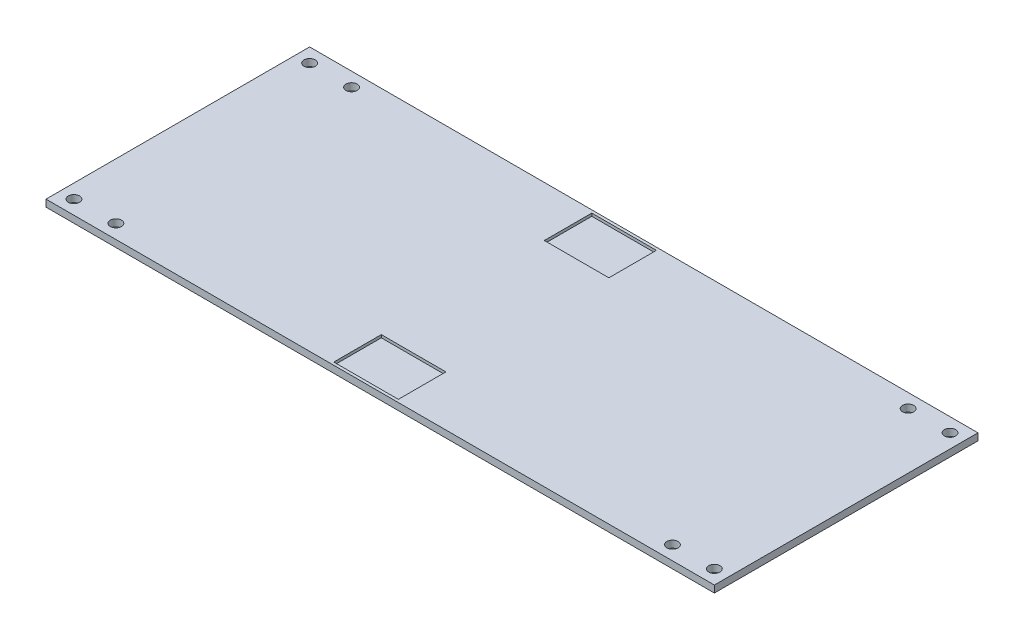
ISO-10303-21;
HEADER;
FILE_DESCRIPTION(('STEP AP214'),'2;1');
FILE_NAME('part.step','',(''),(''),'','','');
FILE_SCHEMA(('AUTOMOTIVE_DESIGN { 1 0 10303 214 1 1 1 1 }'));
ENDSEC;
DATA;
#1=APPLICATION_CONTEXT('core data for automotive mechanical design processes');
#2=APPLICATION_PROTOCOL_DEFINITION('international standard','automotive_design',2000,#1);
#3=PRODUCT_CONTEXT('',#1,'mechanical');
#4=PRODUCT('Part','Part','',(#3));
#5=PRODUCT_RELATED_PRODUCT_CATEGORY('part','',(#4));
#6=PRODUCT_DEFINITION_FORMATION('','',#4);
#7=PRODUCT_DEFINITION_CONTEXT('part definition',#1,'design');
#8=PRODUCT_DEFINITION('design','',#6,#7);
#9=PRODUCT_DEFINITION_SHAPE('','',#8);
#10=(LENGTH_UNIT() NAMED_UNIT(*) SI_UNIT(.MILLI.,.METRE.));
#11=(NAMED_UNIT(*) PLANE_ANGLE_UNIT() SI_UNIT($,.RADIAN.));
#12=(NAMED_UNIT(*) SI_UNIT($,.STERADIAN.) SOLID_ANGLE_UNIT());
#13=UNCERTAINTY_MEASURE_WITH_UNIT(LENGTH_MEASURE(1.E-05),#10,'distance_accuracy_value','');
#14=(GEOMETRIC_REPRESENTATION_CONTEXT(3) GLOBAL_UNCERTAINTY_ASSIGNED_CONTEXT((#13)) GLOBAL_UNIT_ASSIGNED_CONTEXT((#10,
#11,#12)) REPRESENTATION_CONTEXT('',''));
#15=CARTESIAN_POINT('',(0.,0.,0.));
#16=DIRECTION('',(0.,0.,1.));
#17=DIRECTION('',(1.,0.,0.));
#18=AXIS2_PLACEMENT_3D('',#15,#16,#17);
#19=CARTESIAN_POINT('',(0.,5.,0.));
#20=DIRECTION('',(0.,1.,0.));
#21=DIRECTION('',(0.,0.,1.));
#22=AXIS2_PLACEMENT_3D('',#19,#20,#21);
#23=PLANE('',#22);
#24=CARTESIAN_POINT('',(-62.9175454838879,5.,-131.382140187336));
#25=DIRECTION('',(0.,1.,0.));
#26=DIRECTION('',(0.,0.,1.));
#27=AXIS2_PLACEMENT_3D('',#24,#25,#26);
#28=CIRCLE('',#27,4.00000000000001);
#29=CARTESIAN_POINT('',(-62.9175454838879,5.,-127.382140187336));
#30=VERTEX_POINT('',#29);
#31=EDGE_CURVE('E190',#30,#30,#28,.T.);
#32=ORIENTED_EDGE('',*,*,#31,.F.);
#33=EDGE_LOOP('',(#32));
#34=FACE_BOUND('',#33,.T.);
#35=CARTESIAN_POINT('',(395.236140527522,5.,-131.382140187336));
#36=DIRECTION('',(0.,1.,0.));
#37=DIRECTION('',(0.,0.,1.));
#38=AXIS2_PLACEMENT_3D('',#35,#36,#37);
#39=CIRCLE('',#38,3.99999999999999);
#40=CARTESIAN_POINT('',(395.236140527522,5.,-127.382140187336));
#41=VERTEX_POINT('',#40);
#42=EDGE_CURVE('E193',#41,#41,#39,.T.);
#43=ORIENTED_EDGE('',*,*,#42,.F.);
#44=EDGE_LOOP('',(#43));
#45=FACE_BOUND('',#44,.T.);
#46=DIRECTION('',(1.,0.,0.));
#47=VECTOR('',#46,1.);
#48=CARTESIAN_POINT('',(0.,5.,-141.382140187336));
#49=LINE('',#48,#47);
#50=CARTESIAN_POINT('',(-72.917545483888,5.,-141.382140187336));
#51=VERTEX_POINT('',#50);
#52=CARTESIAN_POINT('',(405.236140527522,5.,-141.382140187336));
#53=VERTEX_POINT('',#52);
#54=EDGE_CURVE('E197',#51,#53,#49,.T.);
#55=ORIENTED_EDGE('',*,*,#54,.F.);
#56=DIRECTION('',(0.,0.,1.));
#57=VECTOR('',#56,1.);
#58=CARTESIAN_POINT('',(-72.9175454838879,5.,0.));
#59=LINE('',#58,#57);
#60=CARTESIAN_POINT('',(-72.9175454838879,5.,47.2115683659722));
#61=VERTEX_POINT('',#60);
#62=EDGE_CURVE('E200',#51,#61,#59,.T.);
#63=ORIENTED_EDGE('',*,*,#62,.T.);
#64=DIRECTION('',(1.,0.,0.));
#65=VECTOR('',#64,1.);
#66=CARTESIAN_POINT('',(0.,5.,47.2115683659722));
#67=LINE('',#66,#65);
#68=CARTESIAN_POINT('',(405.236140527522,5.,47.2115683659721));
#69=VERTEX_POINT('',#68);
#70=EDGE_CURVE('E203',#61,#69,#67,.T.);
#71=ORIENTED_EDGE('',*,*,#70,.T.);
#72=DIRECTION('',(0.,0.,1.));
#73=VECTOR('',#72,1.);
#74=CARTESIAN_POINT('',(405.236140527522,5.,0.));
#75=LINE('',#74,#73);
#76=EDGE_CURVE('E205',#53,#69,#75,.T.);
#77=ORIENTED_EDGE('',*,*,#76,.F.);
#78=EDGE_LOOP('',(#55,#63,#71,#77));
#79=FACE_BOUND('',#78,.T.);
#80=CARTESIAN_POINT('',(-62.9175454838879,5.,37.2115683659721));
#81=DIRECTION('',(0.,1.,0.));
#82=DIRECTION('',(0.,0.,1.));
#83=AXIS2_PLACEMENT_3D('',#80,#81,#82);
#84=CIRCLE('',#83,4.00000000000001);
#85=CARTESIAN_POINT('',(-62.9175454838879,5.,41.2115683659721));
#86=VERTEX_POINT('',#85);
#87=EDGE_CURVE('E208',#86,#86,#84,.T.);
#88=ORIENTED_EDGE('',*,*,#87,.F.);
#89=EDGE_LOOP('',(#88));
#90=FACE_BOUND('',#89,.T.);
#91=CARTESIAN_POINT('',(395.236140527521,5.,37.2115683659721));
#92=DIRECTION('',(0.,1.,0.));
#93=DIRECTION('',(0.,0.,1.));
#94=AXIS2_PLACEMENT_3D('',#91,#92,#93);
#95=CIRCLE('',#94,3.99999999999999);
#96=CARTESIAN_POINT('',(395.236140527521,5.,41.2115683659721));
#97=VERTEX_POINT('',#96);
#98=EDGE_CURVE('E211',#97,#97,#95,.T.);
#99=ORIENTED_EDGE('',*,*,#98,.F.);
#100=EDGE_LOOP('',(#99));
#101=FACE_BOUND('',#100,.T.);
#102=CARTESIAN_POINT('',(365.236140527522,5.,37.2115683659722));
#103=DIRECTION('',(0.,1.,0.));
#104=DIRECTION('',(0.,0.,1.));
#105=AXIS2_PLACEMENT_3D('',#102,#103,#104);
#106=CIRCLE('',#105,3.99999999999999);
#107=CARTESIAN_POINT('',(365.236140527522,5.,41.2115683659722));
#108=VERTEX_POINT('',#107);
#109=EDGE_CURVE('E214',#108,#108,#106,.T.);
#110=ORIENTED_EDGE('',*,*,#109,.F.);
#111=EDGE_LOOP('',(#110));
#112=FACE_BOUND('',#111,.T.);
#113=CARTESIAN_POINT('',(-32.9175454838879,5.,37.2115683659721));
#114=DIRECTION('',(0.,1.,0.));
#115=DIRECTION('',(0.,0.,1.));
#116=AXIS2_PLACEMENT_3D('',#113,#114,#115);
#117=CIRCLE('',#116,4.);
#118=CARTESIAN_POINT('',(-32.9175454838879,5.,41.2115683659721));
#119=VERTEX_POINT('',#118);
#120=EDGE_CURVE('E217',#119,#119,#117,.T.);
#121=ORIENTED_EDGE('',*,*,#120,.F.);
#122=EDGE_LOOP('',(#121));
#123=FACE_BOUND('',#122,.T.);
#124=CARTESIAN_POINT('',(365.236140527522,5.,-131.382140187336));
#125=DIRECTION('',(0.,1.,0.));
#126=DIRECTION('',(0.,0.,1.));
#127=AXIS2_PLACEMENT_3D('',#124,#125,#126);
#128=CIRCLE('',#127,3.99999999999999);
#129=CARTESIAN_POINT('',(365.236140527522,5.,-127.382140187336));
#130=VERTEX_POINT('',#129);
#131=EDGE_CURVE('E220',#130,#130,#128,.T.);
#132=ORIENTED_EDGE('',*,*,#131,.F.);
#133=EDGE_LOOP('',(#132));
#134=FACE_BOUND('',#133,.T.);
#135=CARTESIAN_POINT('',(-32.9175454838879,5.,-131.382140187336));
#136=DIRECTION('',(0.,1.,0.));
#137=DIRECTION('',(0.,0.,1.));
#138=AXIS2_PLACEMENT_3D('',#135,#136,#137);
#139=CIRCLE('',#138,4.);
#140=CARTESIAN_POINT('',(-32.9175454838879,5.,-127.382140187336));
#141=VERTEX_POINT('',#140);
#142=EDGE_CURVE('E223',#141,#141,#139,.T.);
#143=ORIENTED_EDGE('',*,*,#142,.F.);
#144=EDGE_LOOP('',(#143));
#145=FACE_BOUND('',#144,.T.);
#146=DIRECTION('',(0.,0.,-1.));
#147=VECTOR('',#146,1.);
#148=CARTESIAN_POINT('',(130.959297521817,5.,0.));
#149=LINE('',#148,#147);
#150=CARTESIAN_POINT('',(130.959297521817,5.,45.2115683659722));
#151=VERTEX_POINT('',#150);
#152=CARTESIAN_POINT('',(130.959297521817,5.,11.2115683659722));
#153=VERTEX_POINT('',#152);
#154=EDGE_CURVE('E176',#151,#153,#149,.T.);
#155=ORIENTED_EDGE('',*,*,#154,.T.);
#156=DIRECTION('',(1.,0.,0.));
#157=VECTOR('',#156,1.);
#158=CARTESIAN_POINT('',(0.,5.,11.2115683659722));
#159=LINE('',#158,#157);
#160=CARTESIAN_POINT('',(177.159297521817,5.,11.2115683659722));
#161=VERTEX_POINT('',#160);
#162=EDGE_CURVE('E58',#153,#161,#159,.T.);
#163=ORIENTED_EDGE('',*,*,#162,.T.);
#164=DIRECTION('',(0.,0.,-1.));
#165=VECTOR('',#164,1.);
#166=CARTESIAN_POINT('',(177.159297521817,5.,0.));
#167=LINE('',#166,#165);
#168=CARTESIAN_POINT('',(177.159297521817,5.,45.2115683659722));
#169=VERTEX_POINT('',#168);
#170=EDGE_CURVE('E167',#169,#161,#167,.T.);
#171=ORIENTED_EDGE('',*,*,#170,.F.);
#172=DIRECTION('',(-1.,0.,0.));
#173=VECTOR('',#172,1.);
#174=CARTESIAN_POINT('',(0.,5.,45.2115683659722));
#175=LINE('',#174,#173);
#176=EDGE_CURVE('E179',#169,#151,#175,.T.);
#177=ORIENTED_EDGE('',*,*,#176,.T.);
#178=EDGE_LOOP('',(#155,#163,#171,#177));
#179=FACE_BOUND('',#178,.T.);
#180=DIRECTION('',(0.,0.,-1.));
#181=VECTOR('',#180,1.);
#182=CARTESIAN_POINT('',(177.159297521817,5.,0.));
#183=LINE('',#182,#181);
#184=CARTESIAN_POINT('',(177.159297521817,5.,-105.382140187336));
#185=VERTEX_POINT('',#184);
#186=CARTESIAN_POINT('',(177.159297521817,5.,-139.382140187336));
#187=VERTEX_POINT('',#186);
#188=EDGE_CURVE('E150',#185,#187,#183,.T.);
#189=ORIENTED_EDGE('',*,*,#188,.F.);
#190=DIRECTION('',(-1.,0.,0.));
#191=VECTOR('',#190,1.);
#192=CARTESIAN_POINT('',(0.,5.,-105.382140187336));
#193=LINE('',#192,#191);
#194=CARTESIAN_POINT('',(130.959297521817,5.,-105.382140187336));
#195=VERTEX_POINT('',#194);
#196=EDGE_CURVE('E50',#185,#195,#193,.T.);
#197=ORIENTED_EDGE('',*,*,#196,.T.);
#198=DIRECTION('',(0.,0.,-1.));
#199=VECTOR('',#198,1.);
#200=CARTESIAN_POINT('',(130.959297521817,5.,0.));
#201=LINE('',#200,#199);
#202=CARTESIAN_POINT('',(130.959297521817,5.,-139.382140187336));
#203=VERTEX_POINT('',#202);
#204=EDGE_CURVE('E140',#195,#203,#201,.T.);
#205=ORIENTED_EDGE('',*,*,#204,.T.);
#206=DIRECTION('',(-1.,0.,0.));
#207=VECTOR('',#206,1.);
#208=CARTESIAN_POINT('',(0.,5.,-139.382140187336));
#209=LINE('',#208,#207);
#210=EDGE_CURVE('E153',#187,#203,#209,.T.);
#211=ORIENTED_EDGE('',*,*,#210,.F.);
#212=EDGE_LOOP('',(#189,#197,#205,#211));
#213=FACE_BOUND('',#212,.T.);
#214=ADVANCED_FACE('F35',(#34,#45,#79,#90,#101,#112,#123,#134,#145,#179,#213),#23,.T.);
#215=CARTESIAN_POINT('',(0.,5.,-141.382140187336));
#216=DIRECTION('',(0.,0.,-1.));
#217=DIRECTION('',(-1.,0.,0.));
#218=AXIS2_PLACEMENT_3D('',#215,#216,#217);
#219=PLANE('',#218);
#220=DIRECTION('',(1.,0.,0.));
#221=VECTOR('',#220,1.);
#222=CARTESIAN_POINT('',(0.,0.,-141.382140187336));
#223=LINE('',#222,#221);
#224=CARTESIAN_POINT('',(-72.917545483888,0.,-141.382140187336));
#225=VERTEX_POINT('',#224);
#226=CARTESIAN_POINT('',(405.236140527522,0.,-141.382140187336));
#227=VERTEX_POINT('',#226);
#228=EDGE_CURVE('E232',#225,#227,#223,.T.);
#229=ORIENTED_EDGE('',*,*,#228,.F.);
#230=DIRECTION('',(0.,-1.,0.));
#231=VECTOR('',#230,1.);
#232=CARTESIAN_POINT('',(-72.917545483888,5.,-141.382140187336));
#233=LINE('',#232,#231);
#234=EDGE_CURVE('E11',#51,#225,#233,.T.);
#235=ORIENTED_EDGE('',*,*,#234,.F.);
#236=ORIENTED_EDGE('',*,*,#54,.T.);
#237=DIRECTION('',(0.,-1.,0.));
#238=VECTOR('',#237,1.);
#239=CARTESIAN_POINT('',(405.236140527522,5.,-141.382140187336));
#240=LINE('',#239,#238);
#241=EDGE_CURVE('E226',#53,#227,#240,.T.);
#242=ORIENTED_EDGE('',*,*,#241,.T.);
#243=EDGE_LOOP('',(#229,#235,#236,#242));
#244=FACE_BOUND('',#243,.T.);
#245=ADVANCED_FACE('F278',(#244),#219,.T.);
#246=CARTESIAN_POINT('',(-72.9175454838879,5.,0.));
#247=DIRECTION('',(1.,0.,0.));
#248=DIRECTION('',(0.,0.,-1.));
#249=AXIS2_PLACEMENT_3D('',#246,#247,#248);
#250=PLANE('',#249);
#251=DIRECTION('',(0.,0.,1.));
#252=VECTOR('',#251,1.);
#253=CARTESIAN_POINT('',(-72.9175454838879,0.,0.));
#254=LINE('',#253,#252);
#255=CARTESIAN_POINT('',(-72.9175454838879,0.,47.2115683659722));
#256=VERTEX_POINT('',#255);
#257=EDGE_CURVE('E235',#225,#256,#254,.T.);
#258=ORIENTED_EDGE('',*,*,#257,.T.);
#259=DIRECTION('',(0.,-1.,0.));
#260=VECTOR('',#259,1.);
#261=CARTESIAN_POINT('',(-72.9175454838879,5.,47.2115683659722));
#262=LINE('',#261,#260);
#263=EDGE_CURVE('E43',#61,#256,#262,.T.);
#264=ORIENTED_EDGE('',*,*,#263,.F.);
#265=ORIENTED_EDGE('',*,*,#62,.F.);
#266=ORIENTED_EDGE('',*,*,#234,.T.);
#267=EDGE_LOOP('',(#258,#264,#265,#266));
#268=FACE_BOUND('',#267,.T.);
#269=ADVANCED_FACE('F271',(#268),#250,.F.);
#270=CARTESIAN_POINT('',(0.,5.,47.2115683659722));
#271=DIRECTION('',(0.,0.,-1.));
#272=DIRECTION('',(-1.,0.,0.));
#273=AXIS2_PLACEMENT_3D('',#270,#271,#272);
#274=PLANE('',#273);
#275=DIRECTION('',(1.,0.,0.));
#276=VECTOR('',#275,1.);
#277=CARTESIAN_POINT('',(0.,0.,47.2115683659722));
#278=LINE('',#277,#276);
#279=CARTESIAN_POINT('',(405.236140527522,0.,47.2115683659721));
#280=VERTEX_POINT('',#279);
#281=EDGE_CURVE('E238',#256,#280,#278,.T.);
#282=ORIENTED_EDGE('',*,*,#281,.T.);
#283=DIRECTION('',(0.,-1.,0.));
#284=VECTOR('',#283,1.);
#285=CARTESIAN_POINT('',(405.236140527522,5.,47.2115683659721));
#286=LINE('',#285,#284);
#287=EDGE_CURVE('E262',#69,#280,#286,.T.);
#288=ORIENTED_EDGE('',*,*,#287,.F.);
#289=ORIENTED_EDGE('',*,*,#70,.F.);
#290=ORIENTED_EDGE('',*,*,#263,.T.);
#291=EDGE_LOOP('',(#282,#288,#289,#290));
#292=FACE_BOUND('',#291,.T.);
#293=ADVANCED_FACE('F266',(#292),#274,.F.);
#294=CARTESIAN_POINT('',(365.236140527522,5.,-131.382140187336));
#295=DIRECTION('',(0.,-1.,0.));
#296=DIRECTION('',(0.,0.,-1.));
#297=AXIS2_PLACEMENT_3D('',#294,#295,#296);
#298=CYLINDRICAL_SURFACE('',#297,3.99999999999999);
#299=ORIENTED_EDGE('',*,*,#131,.T.);
#300=EDGE_LOOP('',(#299));
#301=FACE_BOUND('',#300,.T.);
#302=CARTESIAN_POINT('',(365.236140527522,0.,-131.382140187336));
#303=DIRECTION('',(0.,1.,0.));
#304=DIRECTION('',(0.,0.,1.));
#305=AXIS2_PLACEMENT_3D('',#302,#303,#304);
#306=CIRCLE('',#305,3.99999999999999);
#307=CARTESIAN_POINT('',(365.236140527522,0.,-127.382140187336));
#308=VERTEX_POINT('',#307);
#309=EDGE_CURVE('E256',#308,#308,#306,.T.);
#310=ORIENTED_EDGE('',*,*,#309,.F.);
#311=EDGE_LOOP('',(#310));
#312=FACE_BOUND('',#311,.T.);
#313=ADVANCED_FACE('F346',(#301,#312),#298,.F.);
#314=CARTESIAN_POINT('',(-32.9175454838879,5.,37.2115683659721));
#315=DIRECTION('',(0.,-1.,0.));
#316=DIRECTION('',(0.,0.,-1.));
#317=AXIS2_PLACEMENT_3D('',#314,#315,#316);
#318=CYLINDRICAL_SURFACE('',#317,4.);
#319=ORIENTED_EDGE('',*,*,#120,.T.);
#320=EDGE_LOOP('',(#319));
#321=FACE_BOUND('',#320,.T.);
#322=CARTESIAN_POINT('',(-32.9175454838879,0.,37.2115683659721));
#323=DIRECTION('',(0.,1.,0.));
#324=DIRECTION('',(0.,0.,1.));
#325=AXIS2_PLACEMENT_3D('',#322,#323,#324);
#326=CIRCLE('',#325,4.);
#327=CARTESIAN_POINT('',(-32.9175454838879,0.,41.2115683659721));
#328=VERTEX_POINT('',#327);
#329=EDGE_CURVE('E253',#328,#328,#326,.T.);
#330=ORIENTED_EDGE('',*,*,#329,.F.);
#331=EDGE_LOOP('',(#330));
#332=FACE_BOUND('',#331,.T.);
#333=ADVANCED_FACE('F349',(#321,#332),#318,.F.);
#334=CARTESIAN_POINT('',(365.236140527522,5.,37.2115683659722));
#335=DIRECTION('',(0.,-1.,0.));
#336=DIRECTION('',(0.,0.,-1.));
#337=AXIS2_PLACEMENT_3D('',#334,#335,#336);
#338=CYLINDRICAL_SURFACE('',#337,3.99999999999999);
#339=ORIENTED_EDGE('',*,*,#109,.T.);
#340=EDGE_LOOP('',(#339));
#341=FACE_BOUND('',#340,.T.);
#342=CARTESIAN_POINT('',(365.236140527522,0.,37.2115683659722));
#343=DIRECTION('',(0.,1.,0.));
#344=DIRECTION('',(0.,0.,1.));
#345=AXIS2_PLACEMENT_3D('',#342,#343,#344);
#346=CIRCLE('',#345,3.99999999999999);
#347=CARTESIAN_POINT('',(365.236140527522,0.,41.2115683659722));
#348=VERTEX_POINT('',#347);
#349=EDGE_CURVE('E250',#348,#348,#346,.T.);
#350=ORIENTED_EDGE('',*,*,#349,.F.);
#351=EDGE_LOOP('',(#350));
#352=FACE_BOUND('',#351,.T.);
#353=ADVANCED_FACE('F353',(#341,#352),#338,.F.);
#354=CARTESIAN_POINT('',(395.236140527521,5.,37.2115683659721));
#355=DIRECTION('',(0.,-1.,0.));
#356=DIRECTION('',(0.,0.,-1.));
#357=AXIS2_PLACEMENT_3D('',#354,#355,#356);
#358=CYLINDRICAL_SURFACE('',#357,3.99999999999999);
#359=ORIENTED_EDGE('',*,*,#98,.T.);
#360=EDGE_LOOP('',(#359));
#361=FACE_BOUND('',#360,.T.);
#362=CARTESIAN_POINT('',(395.236140527521,0.,37.2115683659721));
#363=DIRECTION('',(0.,1.,0.));
#364=DIRECTION('',(0.,0.,1.));
#365=AXIS2_PLACEMENT_3D('',#362,#363,#364);
#366=CIRCLE('',#365,3.99999999999999);
#367=CARTESIAN_POINT('',(395.236140527521,0.,41.2115683659721));
#368=VERTEX_POINT('',#367);
#369=EDGE_CURVE('E247',#368,#368,#366,.T.);
#370=ORIENTED_EDGE('',*,*,#369,.F.);
#371=EDGE_LOOP('',(#370));
#372=FACE_BOUND('',#371,.T.);
#373=ADVANCED_FACE('F357',(#361,#372),#358,.F.);
#374=CARTESIAN_POINT('',(-62.9175454838879,5.,37.2115683659721));
#375=DIRECTION('',(0.,-1.,0.));
#376=DIRECTION('',(0.,0.,-1.));
#377=AXIS2_PLACEMENT_3D('',#374,#375,#376);
#378=CYLINDRICAL_SURFACE('',#377,4.00000000000001);
#379=ORIENTED_EDGE('',*,*,#87,.T.);
#380=EDGE_LOOP('',(#379));
#381=FACE_BOUND('',#380,.T.);
#382=CARTESIAN_POINT('',(-62.9175454838879,0.,37.2115683659721));
#383=DIRECTION('',(0.,1.,0.));
#384=DIRECTION('',(0.,0.,1.));
#385=AXIS2_PLACEMENT_3D('',#382,#383,#384);
#386=CIRCLE('',#385,4.00000000000001);
#387=CARTESIAN_POINT('',(-62.9175454838879,0.,41.2115683659721));
#388=VERTEX_POINT('',#387);
#389=EDGE_CURVE('E244',#388,#388,#386,.T.);
#390=ORIENTED_EDGE('',*,*,#389,.F.);
#391=EDGE_LOOP('',(#390));
#392=FACE_BOUND('',#391,.T.);
#393=ADVANCED_FACE('F361',(#381,#392),#378,.F.);
#394=CARTESIAN_POINT('',(405.236140527522,5.,0.));
#395=DIRECTION('',(1.,0.,0.));
#396=DIRECTION('',(0.,0.,-1.));
#397=AXIS2_PLACEMENT_3D('',#394,#395,#396);
#398=PLANE('',#397);
#399=DIRECTION('',(0.,0.,1.));
#400=VECTOR('',#399,1.);
#401=CARTESIAN_POINT('',(405.236140527522,0.,0.));
#402=LINE('',#401,#400);
#403=EDGE_CURVE('E241',#227,#280,#402,.T.);
#404=ORIENTED_EDGE('',*,*,#403,.F.);
#405=ORIENTED_EDGE('',*,*,#241,.F.);
#406=ORIENTED_EDGE('',*,*,#76,.T.);
#407=ORIENTED_EDGE('',*,*,#287,.T.);
#408=EDGE_LOOP('',(#404,#405,#406,#407));
#409=FACE_BOUND('',#408,.T.);
#410=ADVANCED_FACE('F282',(#409),#398,.T.);
#411=CARTESIAN_POINT('',(395.236140527522,5.,-131.382140187336));
#412=DIRECTION('',(0.,-1.,0.));
#413=DIRECTION('',(0.,0.,-1.));
#414=AXIS2_PLACEMENT_3D('',#411,#412,#413);
#415=CYLINDRICAL_SURFACE('',#414,3.99999999999999);
#416=ORIENTED_EDGE('',*,*,#42,.T.);
#417=EDGE_LOOP('',(#416));
#418=FACE_BOUND('',#417,.T.);
#419=CARTESIAN_POINT('',(395.236140527522,0.,-131.382140187336));
#420=DIRECTION('',(0.,1.,0.));
#421=DIRECTION('',(0.,0.,1.));
#422=AXIS2_PLACEMENT_3D('',#419,#420,#421);
#423=CIRCLE('',#422,3.99999999999999);
#424=CARTESIAN_POINT('',(395.236140527522,0.,-127.382140187336));
#425=VERTEX_POINT('',#424);
#426=EDGE_CURVE('E229',#425,#425,#423,.T.);
#427=ORIENTED_EDGE('',*,*,#426,.F.);
#428=EDGE_LOOP('',(#427));
#429=FACE_BOUND('',#428,.T.);
#430=ADVANCED_FACE('F368',(#418,#429),#415,.F.);
#431=CARTESIAN_POINT('',(-62.9175454838879,5.,-131.382140187336));
#432=DIRECTION('',(0.,-1.,0.));
#433=DIRECTION('',(0.,0.,-1.));
#434=AXIS2_PLACEMENT_3D('',#431,#432,#433);
#435=CYLINDRICAL_SURFACE('',#434,4.00000000000001);
#436=ORIENTED_EDGE('',*,*,#31,.T.);
#437=EDGE_LOOP('',(#436));
#438=FACE_BOUND('',#437,.T.);
#439=CARTESIAN_POINT('',(-62.9175454838879,0.,-131.382140187336));
#440=DIRECTION('',(0.,1.,0.));
#441=DIRECTION('',(0.,0.,1.));
#442=AXIS2_PLACEMENT_3D('',#439,#440,#441);
#443=CIRCLE('',#442,4.00000000000001);
#444=CARTESIAN_POINT('',(-62.9175454838879,0.,-127.382140187336));
#445=VERTEX_POINT('',#444);
#446=EDGE_CURVE('E160',#445,#445,#443,.T.);
#447=ORIENTED_EDGE('',*,*,#446,.F.);
#448=EDGE_LOOP('',(#447));
#449=FACE_BOUND('',#448,.T.);
#450=ADVANCED_FACE('F37',(#438,#449),#435,.F.);
#451=CARTESIAN_POINT('',(-32.9175454838879,5.,-131.382140187336));
#452=DIRECTION('',(0.,-1.,0.));
#453=DIRECTION('',(0.,0.,-1.));
#454=AXIS2_PLACEMENT_3D('',#451,#452,#453);
#455=CYLINDRICAL_SURFACE('',#454,4.);
#456=ORIENTED_EDGE('',*,*,#142,.T.);
#457=EDGE_LOOP('',(#456));
#458=FACE_BOUND('',#457,.T.);
#459=CARTESIAN_POINT('',(-32.9175454838879,0.,-131.382140187336));
#460=DIRECTION('',(0.,1.,0.));
#461=DIRECTION('',(0.,0.,1.));
#462=AXIS2_PLACEMENT_3D('',#459,#460,#461);
#463=CIRCLE('',#462,4.);
#464=CARTESIAN_POINT('',(-32.9175454838879,0.,-127.382140187336));
#465=VERTEX_POINT('',#464);
#466=EDGE_CURVE('E194',#465,#465,#463,.T.);
#467=ORIENTED_EDGE('',*,*,#466,.F.);
#468=EDGE_LOOP('',(#467));
#469=FACE_BOUND('',#468,.T.);
#470=ADVANCED_FACE('F341',(#458,#469),#455,.F.);
#471=CARTESIAN_POINT('',(0.,0.,0.));
#472=DIRECTION('',(0.,1.,0.));
#473=DIRECTION('',(0.,0.,1.));
#474=AXIS2_PLACEMENT_3D('',#471,#472,#473);
#475=PLANE('',#474);
#476=ORIENTED_EDGE('',*,*,#446,.T.);
#477=EDGE_LOOP('',(#476));
#478=FACE_BOUND('',#477,.T.);
#479=ORIENTED_EDGE('',*,*,#426,.T.);
#480=EDGE_LOOP('',(#479));
#481=FACE_BOUND('',#480,.T.);
#482=ORIENTED_EDGE('',*,*,#228,.T.);
#483=ORIENTED_EDGE('',*,*,#403,.T.);
#484=ORIENTED_EDGE('',*,*,#281,.F.);
#485=ORIENTED_EDGE('',*,*,#257,.F.);
#486=EDGE_LOOP('',(#482,#483,#484,#485));
#487=FACE_BOUND('',#486,.T.);
#488=ORIENTED_EDGE('',*,*,#389,.T.);
#489=EDGE_LOOP('',(#488));
#490=FACE_BOUND('',#489,.T.);
#491=ORIENTED_EDGE('',*,*,#369,.T.);
#492=EDGE_LOOP('',(#491));
#493=FACE_BOUND('',#492,.T.);
#494=ORIENTED_EDGE('',*,*,#349,.T.);
#495=EDGE_LOOP('',(#494));
#496=FACE_BOUND('',#495,.T.);
#497=ORIENTED_EDGE('',*,*,#329,.T.);
#498=EDGE_LOOP('',(#497));
#499=FACE_BOUND('',#498,.T.);
#500=ORIENTED_EDGE('',*,*,#309,.T.);
#501=EDGE_LOOP('',(#500));
#502=FACE_BOUND('',#501,.T.);
#503=ORIENTED_EDGE('',*,*,#466,.T.);
#504=EDGE_LOOP('',(#503));
#505=FACE_BOUND('',#504,.T.);
#506=ADVANCED_FACE('F274',(#478,#481,#487,#490,#493,#496,#499,#502,#505),#475,.F.);
#507=CARTESIAN_POINT('',(0.,3.,11.2115683659722));
#508=DIRECTION('',(0.,0.,1.));
#509=DIRECTION('',(1.,0.,0.));
#510=AXIS2_PLACEMENT_3D('',#507,#508,#509);
#511=PLANE('',#510);
#512=ORIENTED_EDGE('',*,*,#162,.F.);
#513=DIRECTION('',(0.,1.,0.));
#514=VECTOR('',#513,1.);
#515=CARTESIAN_POINT('',(130.959297521817,3.,11.2115683659722));
#516=LINE('',#515,#514);
#517=CARTESIAN_POINT('',(130.959297521817,3.,11.2115683659722));
#518=VERTEX_POINT('',#517);
#519=EDGE_CURVE('E174',#518,#153,#516,.T.);
#520=ORIENTED_EDGE('',*,*,#519,.F.);
#521=DIRECTION('',(1.,0.,0.));
#522=VECTOR('',#521,1.);
#523=CARTESIAN_POINT('',(0.,3.,11.2115683659722));
#524=LINE('',#523,#522);
#525=CARTESIAN_POINT('',(177.159297521817,3.,11.2115683659722));
#526=VERTEX_POINT('',#525);
#527=EDGE_CURVE('E164',#518,#526,#524,.T.);
#528=ORIENTED_EDGE('',*,*,#527,.T.);
#529=DIRECTION('',(0.,1.,0.));
#530=VECTOR('',#529,1.);
#531=CARTESIAN_POINT('',(177.159297521817,3.,11.2115683659722));
#532=LINE('',#531,#530);
#533=EDGE_CURVE('E151',#526,#161,#532,.T.);
#534=ORIENTED_EDGE('',*,*,#533,.T.);
#535=EDGE_LOOP('',(#512,#520,#528,#534));
#536=FACE_BOUND('',#535,.T.);
#537=ADVANCED_FACE('F329',(#536),#511,.T.);
#538=CARTESIAN_POINT('',(177.159297521817,3.,0.));
#539=DIRECTION('',(1.,0.,0.));
#540=DIRECTION('',(0.,0.,-1.));
#541=AXIS2_PLACEMENT_3D('',#538,#539,#540);
#542=PLANE('',#541);
#543=ORIENTED_EDGE('',*,*,#170,.T.);
#544=ORIENTED_EDGE('',*,*,#533,.F.);
#545=DIRECTION('',(0.,0.,-1.));
#546=VECTOR('',#545,1.);
#547=CARTESIAN_POINT('',(177.159297521817,3.,0.));
#548=LINE('',#547,#546);
#549=CARTESIAN_POINT('',(177.159297521817,3.,45.2115683659722));
#550=VERTEX_POINT('',#549);
#551=EDGE_CURVE('E171',#550,#526,#548,.T.);
#552=ORIENTED_EDGE('',*,*,#551,.F.);
#553=DIRECTION('',(0.,1.,0.));
#554=VECTOR('',#553,1.);
#555=CARTESIAN_POINT('',(177.159297521817,3.,45.2115683659722));
#556=LINE('',#555,#554);
#557=EDGE_CURVE('E185',#550,#169,#556,.T.);
#558=ORIENTED_EDGE('',*,*,#557,.T.);
#559=EDGE_LOOP('',(#543,#544,#552,#558));
#560=FACE_BOUND('',#559,.T.);
#561=ADVANCED_FACE('F325',(#560),#542,.F.);
#562=CARTESIAN_POINT('',(0.,3.,45.2115683659722));
#563=DIRECTION('',(0.,0.,-1.));
#564=DIRECTION('',(-1.,0.,0.));
#565=AXIS2_PLACEMENT_3D('',#562,#563,#564);
#566=PLANE('',#565);
#567=ORIENTED_EDGE('',*,*,#176,.F.);
#568=ORIENTED_EDGE('',*,*,#557,.F.);
#569=DIRECTION('',(-1.,0.,0.));
#570=VECTOR('',#569,1.);
#571=CARTESIAN_POINT('',(0.,3.,45.2115683659722));
#572=LINE('',#571,#570);
#573=CARTESIAN_POINT('',(130.959297521817,3.,45.2115683659722));
#574=VERTEX_POINT('',#573);
#575=EDGE_CURVE('E169',#550,#574,#572,.T.);
#576=ORIENTED_EDGE('',*,*,#575,.T.);
#577=DIRECTION('',(0.,1.,0.));
#578=VECTOR('',#577,1.);
#579=CARTESIAN_POINT('',(130.959297521817,3.,45.2115683659722));
#580=LINE('',#579,#578);
#581=EDGE_CURVE('E187',#574,#151,#580,.T.);
#582=ORIENTED_EDGE('',*,*,#581,.T.);
#583=EDGE_LOOP('',(#567,#568,#576,#582));
#584=FACE_BOUND('',#583,.T.);
#585=ADVANCED_FACE('F328',(#584),#566,.T.);
#586=CARTESIAN_POINT('',(130.959297521817,3.,0.));
#587=DIRECTION('',(1.,0.,0.));
#588=DIRECTION('',(0.,0.,-1.));
#589=AXIS2_PLACEMENT_3D('',#586,#587,#588);
#590=PLANE('',#589);
#591=ORIENTED_EDGE('',*,*,#154,.F.);
#592=ORIENTED_EDGE('',*,*,#581,.F.);
#593=DIRECTION('',(0.,0.,-1.));
#594=VECTOR('',#593,1.);
#595=CARTESIAN_POINT('',(130.959297521817,3.,0.));
#596=LINE('',#595,#594);
#597=EDGE_CURVE('E166',#574,#518,#596,.T.);
#598=ORIENTED_EDGE('',*,*,#597,.T.);
#599=ORIENTED_EDGE('',*,*,#519,.T.);
#600=EDGE_LOOP('',(#591,#592,#598,#599));
#601=FACE_BOUND('',#600,.T.);
#602=ADVANCED_FACE('F323',(#601),#590,.T.);
#603=CARTESIAN_POINT('',(0.,3.,0.));
#604=DIRECTION('',(0.,1.,0.));
#605=DIRECTION('',(0.,0.,1.));
#606=AXIS2_PLACEMENT_3D('',#603,#604,#605);
#607=PLANE('',#606);
#608=ORIENTED_EDGE('',*,*,#527,.F.);
#609=ORIENTED_EDGE('',*,*,#597,.F.);
#610=ORIENTED_EDGE('',*,*,#575,.F.);
#611=ORIENTED_EDGE('',*,*,#551,.T.);
#612=EDGE_LOOP('',(#608,#609,#610,#611));
#613=FACE_BOUND('',#612,.T.);
#614=ADVANCED_FACE('F315',(#613),#607,.T.);
#615=CARTESIAN_POINT('',(0.,3.,-105.382140187336));
#616=DIRECTION('',(0.,0.,-1.));
#617=DIRECTION('',(-1.,0.,0.));
#618=AXIS2_PLACEMENT_3D('',#615,#616,#617);
#619=PLANE('',#618);
#620=ORIENTED_EDGE('',*,*,#196,.F.);
#621=DIRECTION('',(0.,1.,0.));
#622=VECTOR('',#621,1.);
#623=CARTESIAN_POINT('',(177.159297521817,3.,-105.382140187336));
#624=LINE('',#623,#622);
#625=CARTESIAN_POINT('',(177.159297521817,3.,-105.382140187336));
#626=VERTEX_POINT('',#625);
#627=EDGE_CURVE('E123',#626,#185,#624,.T.);
#628=ORIENTED_EDGE('',*,*,#627,.F.);
#629=DIRECTION('',(-1.,0.,0.));
#630=VECTOR('',#629,1.);
#631=CARTESIAN_POINT('',(0.,3.,-105.382140187336));
#632=LINE('',#631,#630);
#633=CARTESIAN_POINT('',(130.959297521817,3.,-105.382140187336));
#634=VERTEX_POINT('',#633);
#635=EDGE_CURVE('E126',#626,#634,#632,.T.);
#636=ORIENTED_EDGE('',*,*,#635,.T.);
#637=DIRECTION('',(0.,1.,0.));
#638=VECTOR('',#637,1.);
#639=CARTESIAN_POINT('',(130.959297521817,3.,-105.382140187336));
#640=LINE('',#639,#638);
#641=EDGE_CURVE('E158',#634,#195,#640,.T.);
#642=ORIENTED_EDGE('',*,*,#641,.T.);
#643=EDGE_LOOP('',(#620,#628,#636,#642));
#644=FACE_BOUND('',#643,.T.);
#645=ADVANCED_FACE('F125',(#644),#619,.T.);
#646=CARTESIAN_POINT('',(130.959297521817,3.,0.));
#647=DIRECTION('',(1.,0.,0.));
#648=DIRECTION('',(0.,0.,-1.));
#649=AXIS2_PLACEMENT_3D('',#646,#647,#648);
#650=PLANE('',#649);
#651=ORIENTED_EDGE('',*,*,#204,.F.);
#652=ORIENTED_EDGE('',*,*,#641,.F.);
#653=DIRECTION('',(0.,0.,-1.));
#654=VECTOR('',#653,1.);
#655=CARTESIAN_POINT('',(130.959297521817,3.,0.));
#656=LINE('',#655,#654);
#657=CARTESIAN_POINT('',(130.959297521817,3.,-139.382140187336));
#658=VERTEX_POINT('',#657);
#659=EDGE_CURVE('E133',#634,#658,#656,.T.);
#660=ORIENTED_EDGE('',*,*,#659,.T.);
#661=DIRECTION('',(0.,1.,0.));
#662=VECTOR('',#661,1.);
#663=CARTESIAN_POINT('',(130.959297521817,3.,-139.382140187336));
#664=LINE('',#663,#662);
#665=EDGE_CURVE('E161',#658,#203,#664,.T.);
#666=ORIENTED_EDGE('',*,*,#665,.T.);
#667=EDGE_LOOP('',(#651,#652,#660,#666));
#668=FACE_BOUND('',#667,.T.);
#669=ADVANCED_FACE('F307',(#668),#650,.T.);
#670=CARTESIAN_POINT('',(0.,3.,-139.382140187336));
#671=DIRECTION('',(0.,0.,-1.));
#672=DIRECTION('',(-1.,0.,0.));
#673=AXIS2_PLACEMENT_3D('',#670,#671,#672);
#674=PLANE('',#673);
#675=ORIENTED_EDGE('',*,*,#210,.T.);
#676=ORIENTED_EDGE('',*,*,#665,.F.);
#677=DIRECTION('',(-1.,0.,0.));
#678=VECTOR('',#677,1.);
#679=CARTESIAN_POINT('',(0.,3.,-139.382140187336));
#680=LINE('',#679,#678);
#681=CARTESIAN_POINT('',(177.159297521817,3.,-139.382140187336));
#682=VERTEX_POINT('',#681);
#683=EDGE_CURVE('E144',#682,#658,#680,.T.);
#684=ORIENTED_EDGE('',*,*,#683,.F.);
#685=DIRECTION('',(0.,1.,0.));
#686=VECTOR('',#685,1.);
#687=CARTESIAN_POINT('',(177.159297521817,3.,-139.382140187336));
#688=LINE('',#687,#686);
#689=EDGE_CURVE('E132',#682,#187,#688,.T.);
#690=ORIENTED_EDGE('',*,*,#689,.T.);
#691=EDGE_LOOP('',(#675,#676,#684,#690));
#692=FACE_BOUND('',#691,.T.);
#693=ADVANCED_FACE('F305',(#692),#674,.F.);
#694=CARTESIAN_POINT('',(177.159297521817,3.,0.));
#695=DIRECTION('',(1.,0.,0.));
#696=DIRECTION('',(0.,0.,-1.));
#697=AXIS2_PLACEMENT_3D('',#694,#695,#696);
#698=PLANE('',#697);
#699=ORIENTED_EDGE('',*,*,#188,.T.);
#700=ORIENTED_EDGE('',*,*,#689,.F.);
#701=DIRECTION('',(0.,0.,-1.));
#702=VECTOR('',#701,1.);
#703=CARTESIAN_POINT('',(177.159297521817,3.,0.));
#704=LINE('',#703,#702);
#705=EDGE_CURVE('E139',#626,#682,#704,.T.);
#706=ORIENTED_EDGE('',*,*,#705,.F.);
#707=ORIENTED_EDGE('',*,*,#627,.T.);
#708=EDGE_LOOP('',(#699,#700,#706,#707));
#709=FACE_BOUND('',#708,.T.);
#710=ADVANCED_FACE('F142',(#709),#698,.F.);
#711=CARTESIAN_POINT('',(0.,3.,0.));
#712=DIRECTION('',(0.,1.,0.));
#713=DIRECTION('',(0.,0.,1.));
#714=AXIS2_PLACEMENT_3D('',#711,#712,#713);
#715=PLANE('',#714);
#716=ORIENTED_EDGE('',*,*,#635,.F.);
#717=ORIENTED_EDGE('',*,*,#705,.T.);
#718=ORIENTED_EDGE('',*,*,#683,.T.);
#719=ORIENTED_EDGE('',*,*,#659,.F.);
#720=EDGE_LOOP('',(#716,#717,#718,#719));
#721=FACE_BOUND('',#720,.T.);
#722=ADVANCED_FACE('F137',(#721),#715,.T.);
#723=CLOSED_SHELL('',(#214,#245,#269,#293,#313,#333,#353,#373,#393,#410,#430,#450,#470,#506,
#537,#561,#585,#602,#614,#645,#669,#693,#710,#722));
#724=MANIFOLD_SOLID_BREP('B2',#723);
#725=ADVANCED_BREP_SHAPE_REPRESENTATION('',(#18,#724),#14);
#726=SHAPE_DEFINITION_REPRESENTATION(#9,#725);
ENDSEC;
END-ISO-10303-21;
